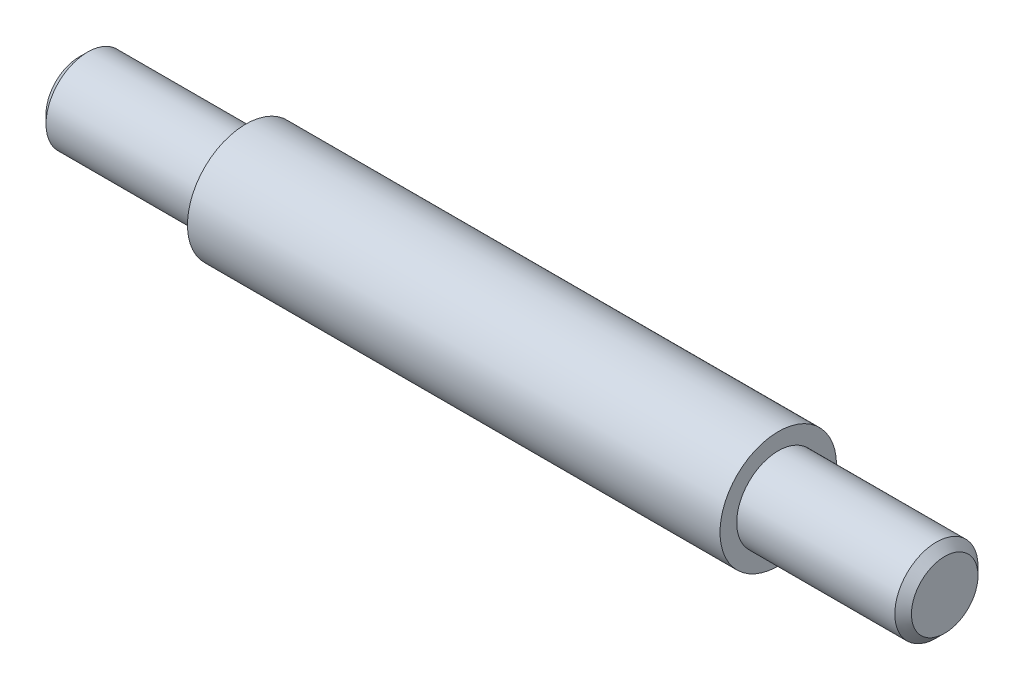
ISO-10303-21;
HEADER;
FILE_DESCRIPTION(('STEP AP214'),'2;1');
FILE_NAME('part.step','',(''),(''),'','','');
FILE_SCHEMA(('AUTOMOTIVE_DESIGN { 1 0 10303 214 1 1 1 1 }'));
ENDSEC;
DATA;
#1=APPLICATION_CONTEXT('core data for automotive mechanical design processes');
#2=APPLICATION_PROTOCOL_DEFINITION('international standard','automotive_design',2000,#1);
#3=PRODUCT_CONTEXT('',#1,'mechanical');
#4=PRODUCT('Part','Part','',(#3));
#5=PRODUCT_RELATED_PRODUCT_CATEGORY('part','',(#4));
#6=PRODUCT_DEFINITION_FORMATION('','',#4);
#7=PRODUCT_DEFINITION_CONTEXT('part definition',#1,'design');
#8=PRODUCT_DEFINITION('design','',#6,#7);
#9=PRODUCT_DEFINITION_SHAPE('','',#8);
#10=(LENGTH_UNIT() NAMED_UNIT(*) SI_UNIT(.MILLI.,.METRE.));
#11=(NAMED_UNIT(*) PLANE_ANGLE_UNIT() SI_UNIT($,.RADIAN.));
#12=(NAMED_UNIT(*) SI_UNIT($,.STERADIAN.) SOLID_ANGLE_UNIT());
#13=UNCERTAINTY_MEASURE_WITH_UNIT(LENGTH_MEASURE(1.E-05),#10,'distance_accuracy_value','');
#14=(GEOMETRIC_REPRESENTATION_CONTEXT(3) GLOBAL_UNCERTAINTY_ASSIGNED_CONTEXT((#13)) GLOBAL_UNIT_ASSIGNED_CONTEXT((#10,
#11,#12)) REPRESENTATION_CONTEXT('',''));
#15=CARTESIAN_POINT('',(0.,0.,0.));
#16=DIRECTION('',(0.,0.,1.));
#17=DIRECTION('',(1.,0.,0.));
#18=AXIS2_PLACEMENT_3D('',#15,#16,#17);
#19=CARTESIAN_POINT('',(-16.,0.,80.));
#20=DIRECTION('',(1.,0.,0.));
#21=DIRECTION('',(0.,0.,-1.));
#22=AXIS2_PLACEMENT_3D('',#19,#20,#21);
#23=PLANE('',#22);
#24=CARTESIAN_POINT('',(-16.,0.,80.));
#25=DIRECTION('',(1.,0.,0.));
#26=DIRECTION('',(0.,0.,-1.));
#27=AXIS2_PLACEMENT_3D('',#24,#25,#26);
#28=CIRCLE('',#27,3.50000000000001);
#29=CARTESIAN_POINT('',(-16.,0.,76.5));
#30=VERTEX_POINT('',#29);
#31=EDGE_CURVE('E55',#30,#30,#28,.T.);
#32=ORIENTED_EDGE('',*,*,#31,.F.);
#33=EDGE_LOOP('',(#32));
#34=FACE_BOUND('',#33,.T.);
#35=CARTESIAN_POINT('',(-16.,0.,80.));
#36=DIRECTION('',(1.,0.,0.));
#37=DIRECTION('',(0.,0.,-1.));
#38=AXIS2_PLACEMENT_3D('',#35,#36,#37);
#39=CIRCLE('',#38,2.50000000000001);
#40=CARTESIAN_POINT('',(-16.,0.,77.5));
#41=VERTEX_POINT('',#40);
#42=EDGE_CURVE('E51',#41,#41,#39,.F.);
#43=ORIENTED_EDGE('',*,*,#42,.F.);
#44=EDGE_LOOP('',(#43));
#45=FACE_BOUND('',#44,.T.);
#46=ADVANCED_FACE('F31',(#34,#45),#23,.F.);
#47=CARTESIAN_POINT('',(16.,0.,80.));
#48=DIRECTION('',(1.,0.,0.));
#49=DIRECTION('',(0.,0.,-1.));
#50=AXIS2_PLACEMENT_3D('',#47,#48,#49);
#51=PLANE('',#50);
#52=CARTESIAN_POINT('',(16.,0.,80.));
#53=DIRECTION('',(1.,0.,0.));
#54=DIRECTION('',(0.,0.,-1.));
#55=AXIS2_PLACEMENT_3D('',#52,#53,#54);
#56=CIRCLE('',#55,3.50000000000001);
#57=CARTESIAN_POINT('',(16.,0.,76.5));
#58=VERTEX_POINT('',#57);
#59=EDGE_CURVE('E54',#58,#58,#56,.T.);
#60=ORIENTED_EDGE('',*,*,#59,.T.);
#61=EDGE_LOOP('',(#60));
#62=FACE_BOUND('',#61,.T.);
#63=CARTESIAN_POINT('',(16.,0.,80.));
#64=DIRECTION('',(1.,0.,0.));
#65=DIRECTION('',(0.,0.,-1.));
#66=AXIS2_PLACEMENT_3D('',#63,#64,#65);
#67=CIRCLE('',#66,2.50000000000001);
#68=CARTESIAN_POINT('',(16.,0.,77.5));
#69=VERTEX_POINT('',#68);
#70=EDGE_CURVE('E58',#69,#69,#67,.T.);
#71=ORIENTED_EDGE('',*,*,#70,.F.);
#72=EDGE_LOOP('',(#71));
#73=FACE_BOUND('',#72,.T.);
#74=ADVANCED_FACE('F66',(#62,#73),#51,.T.);
#75=CARTESIAN_POINT('',(16.,0.,80.));
#76=DIRECTION('',(-1.,0.,0.));
#77=DIRECTION('',(0.,0.,1.));
#78=AXIS2_PLACEMENT_3D('',#75,#76,#77);
#79=CYLINDRICAL_SURFACE('',#78,3.50000000000001);
#80=ORIENTED_EDGE('',*,*,#59,.F.);
#81=EDGE_LOOP('',(#80));
#82=FACE_BOUND('',#81,.T.);
#83=ORIENTED_EDGE('',*,*,#31,.T.);
#84=EDGE_LOOP('',(#83));
#85=FACE_BOUND('',#84,.T.);
#86=ADVANCED_FACE('F68',(#82,#85),#79,.T.);
#87=CARTESIAN_POINT('',(26.,0.,80.));
#88=DIRECTION('',(-1.,0.,0.));
#89=DIRECTION('',(0.,0.,1.));
#90=AXIS2_PLACEMENT_3D('',#87,#88,#89);
#91=CYLINDRICAL_SURFACE('',#90,2.50000000000001);
#92=CARTESIAN_POINT('',(25.5,0.,80.));
#93=DIRECTION('',(1.,0.,0.));
#94=DIRECTION('',(0.,0.,-1.));
#95=AXIS2_PLACEMENT_3D('',#92,#93,#94);
#96=CIRCLE('',#95,2.50000000000001);
#97=CARTESIAN_POINT('',(25.5,0.,77.5));
#98=VERTEX_POINT('',#97);
#99=EDGE_CURVE('E10',#98,#98,#96,.F.);
#100=ORIENTED_EDGE('',*,*,#99,.T.);
#101=EDGE_LOOP('',(#100));
#102=FACE_BOUND('',#101,.T.);
#103=ORIENTED_EDGE('',*,*,#70,.T.);
#104=EDGE_LOOP('',(#103));
#105=FACE_BOUND('',#104,.T.);
#106=ADVANCED_FACE('F64',(#102,#105),#91,.T.);
#107=CARTESIAN_POINT('',(26.,0.,80.));
#108=DIRECTION('',(1.,0.,0.));
#109=DIRECTION('',(0.,0.,-1.));
#110=AXIS2_PLACEMENT_3D('',#107,#108,#109);
#111=PLANE('',#110);
#112=CARTESIAN_POINT('',(26.,0.,80.));
#113=DIRECTION('',(1.,0.,0.));
#114=DIRECTION('',(0.,0.,-1.));
#115=AXIS2_PLACEMENT_3D('',#112,#113,#114);
#116=CIRCLE('',#115,2.);
#117=CARTESIAN_POINT('',(26.,0.,78.));
#118=VERTEX_POINT('',#117);
#119=EDGE_CURVE('E38',#118,#118,#116,.T.);
#120=ORIENTED_EDGE('',*,*,#119,.T.);
#121=EDGE_LOOP('',(#120));
#122=FACE_BOUND('',#121,.T.);
#123=ADVANCED_FACE('F99',(#122),#111,.T.);
#124=CARTESIAN_POINT('',(-26.,0.,80.));
#125=DIRECTION('',(1.,0.,0.));
#126=DIRECTION('',(0.,0.,-1.));
#127=AXIS2_PLACEMENT_3D('',#124,#125,#126);
#128=CYLINDRICAL_SURFACE('',#127,2.50000000000001);
#129=CARTESIAN_POINT('',(-25.5,0.,80.));
#130=DIRECTION('',(-1.,0.,0.));
#131=DIRECTION('',(0.,0.,1.));
#132=AXIS2_PLACEMENT_3D('',#129,#130,#131);
#133=CIRCLE('',#132,2.50000000000001);
#134=CARTESIAN_POINT('',(-25.5,0.,82.5));
#135=VERTEX_POINT('',#134);
#136=EDGE_CURVE('E42',#135,#135,#133,.F.);
#137=ORIENTED_EDGE('',*,*,#136,.T.);
#138=EDGE_LOOP('',(#137));
#139=FACE_BOUND('',#138,.T.);
#140=ORIENTED_EDGE('',*,*,#42,.T.);
#141=EDGE_LOOP('',(#140));
#142=FACE_BOUND('',#141,.T.);
#143=ADVANCED_FACE('F90',(#139,#142),#128,.T.);
#144=CARTESIAN_POINT('',(-26.,0.,80.));
#145=DIRECTION('',(-1.,0.,0.));
#146=DIRECTION('',(0.,0.,1.));
#147=AXIS2_PLACEMENT_3D('',#144,#145,#146);
#148=PLANE('',#147);
#149=CARTESIAN_POINT('',(-26.,0.,80.));
#150=DIRECTION('',(-1.,0.,0.));
#151=DIRECTION('',(0.,0.,1.));
#152=AXIS2_PLACEMENT_3D('',#149,#150,#151);
#153=CIRCLE('',#152,1.99999999999999);
#154=CARTESIAN_POINT('',(-26.,0.,82.));
#155=VERTEX_POINT('',#154);
#156=EDGE_CURVE('E46',#155,#155,#153,.T.);
#157=ORIENTED_EDGE('',*,*,#156,.T.);
#158=EDGE_LOOP('',(#157));
#159=FACE_BOUND('',#158,.T.);
#160=ADVANCED_FACE('F83',(#159),#148,.T.);
#161=CARTESIAN_POINT('',(-26.,0.,80.));
#162=DIRECTION('',(1.,0.,0.));
#163=DIRECTION('',(0.,0.,-1.));
#164=AXIS2_PLACEMENT_3D('',#161,#162,#163);
#165=CONICAL_SURFACE('',#164,1.99999999999999,0.785398163397458);
#166=ORIENTED_EDGE('',*,*,#136,.F.);
#167=EDGE_LOOP('',(#166));
#168=FACE_BOUND('',#167,.T.);
#169=ORIENTED_EDGE('',*,*,#156,.F.);
#170=EDGE_LOOP('',(#169));
#171=FACE_BOUND('',#170,.T.);
#172=ADVANCED_FACE('F81',(#168,#171),#165,.T.);
#173=CARTESIAN_POINT('',(26.,0.,80.));
#174=DIRECTION('',(-1.,0.,0.));
#175=DIRECTION('',(0.,0.,1.));
#176=AXIS2_PLACEMENT_3D('',#173,#174,#175);
#177=CONICAL_SURFACE('',#176,2.,0.785398163397451);
#178=ORIENTED_EDGE('',*,*,#99,.F.);
#179=EDGE_LOOP('',(#178));
#180=FACE_BOUND('',#179,.T.);
#181=ORIENTED_EDGE('',*,*,#119,.F.);
#182=EDGE_LOOP('',(#181));
#183=FACE_BOUND('',#182,.T.);
#184=ADVANCED_FACE('F33',(#180,#183),#177,.T.);
#185=CLOSED_SHELL('',(#46,#74,#86,#106,#123,#143,#160,#172,#184));
#186=MANIFOLD_SOLID_BREP('B2',#185);
#187=ADVANCED_BREP_SHAPE_REPRESENTATION('',(#18,#186),#14);
#188=SHAPE_DEFINITION_REPRESENTATION(#9,#187);
ENDSEC;
END-ISO-10303-21;
